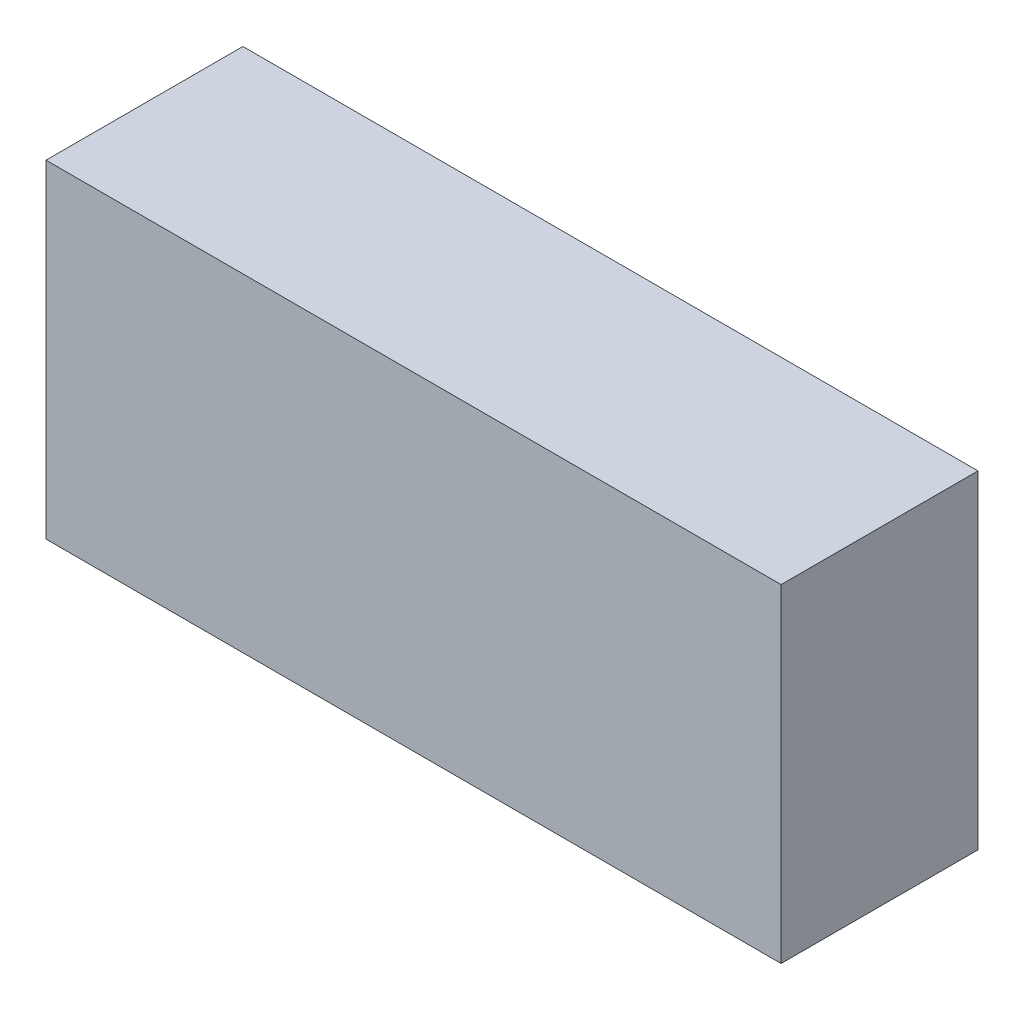
ISO-10303-21;
HEADER;
FILE_DESCRIPTION(('STEP AP214'),'2;1');
FILE_NAME('part.step','',(''),(''),'','','');
FILE_SCHEMA(('AUTOMOTIVE_DESIGN { 1 0 10303 214 1 1 1 1 }'));
ENDSEC;
DATA;
#1=APPLICATION_CONTEXT('core data for automotive mechanical design processes');
#2=APPLICATION_PROTOCOL_DEFINITION('international standard','automotive_design',2000,#1);
#3=PRODUCT_CONTEXT('',#1,'mechanical');
#4=PRODUCT('Part','Part','',(#3));
#5=PRODUCT_RELATED_PRODUCT_CATEGORY('part','',(#4));
#6=PRODUCT_DEFINITION_FORMATION('','',#4);
#7=PRODUCT_DEFINITION_CONTEXT('part definition',#1,'design');
#8=PRODUCT_DEFINITION('design','',#6,#7);
#9=PRODUCT_DEFINITION_SHAPE('','',#8);
#10=(LENGTH_UNIT() NAMED_UNIT(*) SI_UNIT(.MILLI.,.METRE.));
#11=(NAMED_UNIT(*) PLANE_ANGLE_UNIT() SI_UNIT($,.RADIAN.));
#12=(NAMED_UNIT(*) SI_UNIT($,.STERADIAN.) SOLID_ANGLE_UNIT());
#13=UNCERTAINTY_MEASURE_WITH_UNIT(LENGTH_MEASURE(1.E-05),#10,'distance_accuracy_value','');
#14=(GEOMETRIC_REPRESENTATION_CONTEXT(3) GLOBAL_UNCERTAINTY_ASSIGNED_CONTEXT((#13)) GLOBAL_UNIT_ASSIGNED_CONTEXT((#10,
#11,#12)) REPRESENTATION_CONTEXT('',''));
#15=CARTESIAN_POINT('',(0.,0.,0.));
#16=DIRECTION('',(0.,0.,1.));
#17=DIRECTION('',(1.,0.,0.));
#18=AXIS2_PLACEMENT_3D('',#15,#16,#17);
#19=CARTESIAN_POINT('',(0.,0.,0.599999999999886));
#20=DIRECTION('',(0.,0.,1.));
#21=DIRECTION('',(1.,0.,0.));
#22=AXIS2_PLACEMENT_3D('',#19,#20,#21);
#23=PLANE('',#22);
#24=DIRECTION('',(0.,1.,0.));
#25=VECTOR('',#24,1.);
#26=CARTESIAN_POINT('',(-1.12000000000009,0.,0.599999999999886));
#27=LINE('',#26,#25);
#28=CARTESIAN_POINT('',(-1.12000000000009,0.500000000000032,0.599999999999886));
#29=VERTEX_POINT('',#28);
#30=CARTESIAN_POINT('',(-1.12000000000009,-0.500000000000032,0.599999999999886));
#31=VERTEX_POINT('',#30);
#32=EDGE_CURVE('E19',#29,#31,#27,.F.);
#33=ORIENTED_EDGE('',*,*,#32,.T.);
#34=DIRECTION('',(1.,0.,0.));
#35=VECTOR('',#34,1.);
#36=CARTESIAN_POINT('',(-1.12000000000009,-0.500000000000032,0.599999999999886));
#37=LINE('',#36,#35);
#38=CARTESIAN_POINT('',(1.12000000000009,-0.500000000000032,0.599999999999886));
#39=VERTEX_POINT('',#38);
#40=EDGE_CURVE('E66',#39,#31,#37,.F.);
#41=ORIENTED_EDGE('',*,*,#40,.F.);
#42=DIRECTION('',(0.,1.,0.));
#43=VECTOR('',#42,1.);
#44=CARTESIAN_POINT('',(1.12000000000009,-0.500000000000032,0.599999999999886));
#45=LINE('',#44,#43);
#46=CARTESIAN_POINT('',(1.12000000000009,0.500000000000032,0.599999999999886));
#47=VERTEX_POINT('',#46);
#48=EDGE_CURVE('E57',#47,#39,#45,.F.);
#49=ORIENTED_EDGE('',*,*,#48,.F.);
#50=DIRECTION('',(1.,0.,0.));
#51=VECTOR('',#50,1.);
#52=CARTESIAN_POINT('',(1.12000000000009,0.500000000000032,0.599999999999886));
#53=LINE('',#52,#51);
#54=EDGE_CURVE('E52',#29,#47,#53,.T.);
#55=ORIENTED_EDGE('',*,*,#54,.F.);
#56=EDGE_LOOP('',(#33,#41,#49,#55));
#57=FACE_BOUND('',#56,.T.);
#58=ADVANCED_FACE('F16',(#57),#23,.T.);
#59=CARTESIAN_POINT('',(-1.12000000000009,-0.500000000000032,0.));
#60=DIRECTION('',(0.,-1.,0.));
#61=DIRECTION('',(0.,0.,-1.));
#62=AXIS2_PLACEMENT_3D('',#59,#60,#61);
#63=PLANE('',#62);
#64=DIRECTION('',(0.,0.,1.));
#65=VECTOR('',#64,1.);
#66=CARTESIAN_POINT('',(-1.12000000000009,-0.500000000000032,0.));
#67=LINE('',#66,#65);
#68=CARTESIAN_POINT('',(-1.12000000000009,-0.500000000000032,0.));
#69=VERTEX_POINT('',#68);
#70=EDGE_CURVE('E79',#69,#31,#67,.T.);
#71=ORIENTED_EDGE('',*,*,#70,.F.);
#72=DIRECTION('',(1.,0.,0.));
#73=VECTOR('',#72,1.);
#74=CARTESIAN_POINT('',(0.,-0.500000000000032,0.));
#75=LINE('',#74,#73);
#76=CARTESIAN_POINT('',(1.12000000000009,-0.500000000000032,0.));
#77=VERTEX_POINT('',#76);
#78=EDGE_CURVE('E74',#69,#77,#75,.T.);
#79=ORIENTED_EDGE('',*,*,#78,.T.);
#80=DIRECTION('',(0.,0.,-1.));
#81=VECTOR('',#80,1.);
#82=CARTESIAN_POINT('',(1.12000000000009,-0.500000000000032,0.));
#83=LINE('',#82,#81);
#84=EDGE_CURVE('E62',#39,#77,#83,.T.);
#85=ORIENTED_EDGE('',*,*,#84,.F.);
#86=ORIENTED_EDGE('',*,*,#40,.T.);
#87=EDGE_LOOP('',(#71,#79,#85,#86));
#88=FACE_BOUND('',#87,.T.);
#89=ADVANCED_FACE('F73',(#88),#63,.T.);
#90=CARTESIAN_POINT('',(1.12000000000009,-0.500000000000032,0.));
#91=DIRECTION('',(1.,0.,0.));
#92=DIRECTION('',(0.,0.,-1.));
#93=AXIS2_PLACEMENT_3D('',#90,#91,#92);
#94=PLANE('',#93);
#95=ORIENTED_EDGE('',*,*,#84,.T.);
#96=DIRECTION('',(0.,1.,0.));
#97=VECTOR('',#96,1.);
#98=CARTESIAN_POINT('',(1.12000000000009,0.,0.));
#99=LINE('',#98,#97);
#100=CARTESIAN_POINT('',(1.12000000000009,0.500000000000032,0.));
#101=VERTEX_POINT('',#100);
#102=EDGE_CURVE('E83',#77,#101,#99,.T.);
#103=ORIENTED_EDGE('',*,*,#102,.T.);
#104=DIRECTION('',(0.,0.,1.));
#105=VECTOR('',#104,1.);
#106=CARTESIAN_POINT('',(1.12000000000009,0.500000000000032,0.));
#107=LINE('',#106,#105);
#108=EDGE_CURVE('E64',#47,#101,#107,.F.);
#109=ORIENTED_EDGE('',*,*,#108,.F.);
#110=ORIENTED_EDGE('',*,*,#48,.T.);
#111=EDGE_LOOP('',(#95,#103,#109,#110));
#112=FACE_BOUND('',#111,.T.);
#113=ADVANCED_FACE('F59',(#112),#94,.T.);
#114=CARTESIAN_POINT('',(1.12000000000009,0.500000000000032,0.));
#115=DIRECTION('',(0.,1.,0.));
#116=DIRECTION('',(0.,0.,1.));
#117=AXIS2_PLACEMENT_3D('',#114,#115,#116);
#118=PLANE('',#117);
#119=ORIENTED_EDGE('',*,*,#108,.T.);
#120=DIRECTION('',(1.,0.,0.));
#121=VECTOR('',#120,1.);
#122=CARTESIAN_POINT('',(0.,0.500000000000032,0.));
#123=LINE('',#122,#121);
#124=CARTESIAN_POINT('',(-1.12000000000009,0.500000000000032,0.));
#125=VERTEX_POINT('',#124);
#126=EDGE_CURVE('E25',#101,#125,#123,.F.);
#127=ORIENTED_EDGE('',*,*,#126,.T.);
#128=DIRECTION('',(0.,0.,1.));
#129=VECTOR('',#128,1.);
#130=CARTESIAN_POINT('',(-1.12000000000009,0.500000000000032,0.));
#131=LINE('',#130,#129);
#132=EDGE_CURVE('E33',#29,#125,#131,.F.);
#133=ORIENTED_EDGE('',*,*,#132,.F.);
#134=ORIENTED_EDGE('',*,*,#54,.T.);
#135=EDGE_LOOP('',(#119,#127,#133,#134));
#136=FACE_BOUND('',#135,.T.);
#137=ADVANCED_FACE('F87',(#136),#118,.T.);
#138=CARTESIAN_POINT('',(-1.12000000000009,0.500000000000032,0.));
#139=DIRECTION('',(-1.,0.,0.));
#140=DIRECTION('',(0.,0.,1.));
#141=AXIS2_PLACEMENT_3D('',#138,#139,#140);
#142=PLANE('',#141);
#143=ORIENTED_EDGE('',*,*,#132,.T.);
#144=DIRECTION('',(0.,1.,0.));
#145=VECTOR('',#144,1.);
#146=CARTESIAN_POINT('',(-1.12000000000009,0.,0.));
#147=LINE('',#146,#145);
#148=EDGE_CURVE('E11',#125,#69,#147,.F.);
#149=ORIENTED_EDGE('',*,*,#148,.T.);
#150=ORIENTED_EDGE('',*,*,#70,.T.);
#151=ORIENTED_EDGE('',*,*,#32,.F.);
#152=EDGE_LOOP('',(#143,#149,#150,#151));
#153=FACE_BOUND('',#152,.T.);
#154=ADVANCED_FACE('F90',(#153),#142,.T.);
#155=CARTESIAN_POINT('',(0.,0.,0.));
#156=DIRECTION('',(0.,0.,1.));
#157=DIRECTION('',(1.,0.,0.));
#158=AXIS2_PLACEMENT_3D('',#155,#156,#157);
#159=PLANE('',#158);
#160=ORIENTED_EDGE('',*,*,#126,.F.);
#161=ORIENTED_EDGE('',*,*,#102,.F.);
#162=ORIENTED_EDGE('',*,*,#78,.F.);
#163=ORIENTED_EDGE('',*,*,#148,.F.);
#164=EDGE_LOOP('',(#160,#161,#162,#163));
#165=FACE_BOUND('',#164,.T.);
#166=ADVANCED_FACE('F89',(#165),#159,.F.);
#167=CLOSED_SHELL('',(#58,#89,#113,#137,#154,#166));
#168=MANIFOLD_SOLID_BREP('B1',#167);
#169=ADVANCED_BREP_SHAPE_REPRESENTATION('',(#18,#168),#14);
#170=SHAPE_DEFINITION_REPRESENTATION(#9,#169);
ENDSEC;
END-ISO-10303-21;
